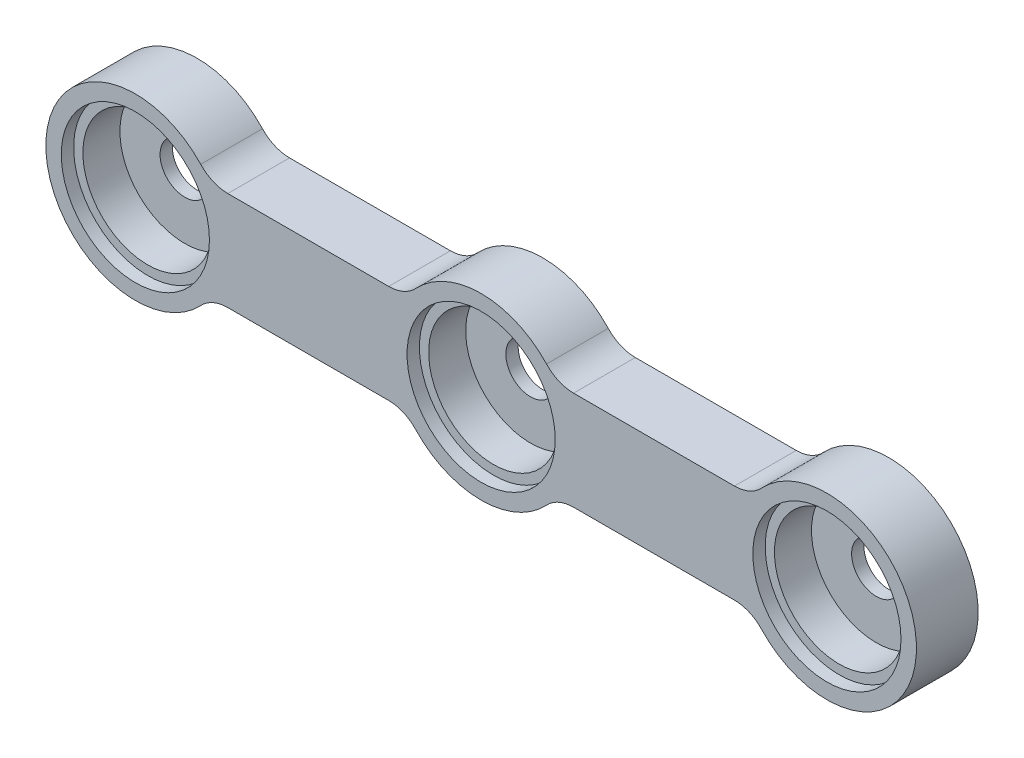
ISO-10303-21;
HEADER;
FILE_DESCRIPTION(('STEP AP214'),'2;1');
FILE_NAME('part.step','',(''),(''),'','','');
FILE_SCHEMA(('AUTOMOTIVE_DESIGN { 1 0 10303 214 1 1 1 1 }'));
ENDSEC;
DATA;
#1=APPLICATION_CONTEXT('core data for automotive mechanical design processes');
#2=APPLICATION_PROTOCOL_DEFINITION('international standard','automotive_design',2000,#1);
#3=PRODUCT_CONTEXT('',#1,'mechanical');
#4=PRODUCT('Part','Part','',(#3));
#5=PRODUCT_RELATED_PRODUCT_CATEGORY('part','',(#4));
#6=PRODUCT_DEFINITION_FORMATION('','',#4);
#7=PRODUCT_DEFINITION_CONTEXT('part definition',#1,'design');
#8=PRODUCT_DEFINITION('design','',#6,#7);
#9=PRODUCT_DEFINITION_SHAPE('','',#8);
#10=(LENGTH_UNIT() NAMED_UNIT(*) SI_UNIT(.MILLI.,.METRE.));
#11=(NAMED_UNIT(*) PLANE_ANGLE_UNIT() SI_UNIT($,.RADIAN.));
#12=(NAMED_UNIT(*) SI_UNIT($,.STERADIAN.) SOLID_ANGLE_UNIT());
#13=UNCERTAINTY_MEASURE_WITH_UNIT(LENGTH_MEASURE(1.E-05),#10,'distance_accuracy_value','');
#14=(GEOMETRIC_REPRESENTATION_CONTEXT(3) GLOBAL_UNCERTAINTY_ASSIGNED_CONTEXT((#13)) GLOBAL_UNIT_ASSIGNED_CONTEXT((#10,
#11,#12)) REPRESENTATION_CONTEXT('',''));
#15=CARTESIAN_POINT('',(0.,0.,0.));
#16=DIRECTION('',(0.,0.,1.));
#17=DIRECTION('',(1.,0.,0.));
#18=AXIS2_PLACEMENT_3D('',#15,#16,#17);
#19=CARTESIAN_POINT('',(-68.758315938752,0.,4.));
#20=DIRECTION('',(0.,0.,-1.));
#21=DIRECTION('',(-1.,0.,0.));
#22=AXIS2_PLACEMENT_3D('',#19,#20,#21);
#23=CYLINDRICAL_SURFACE('',#22,2.);
#24=CARTESIAN_POINT('',(-68.758315938752,0.,0.));
#25=DIRECTION('',(0.,0.,-1.));
#26=DIRECTION('',(1.,0.,0.));
#27=AXIS2_PLACEMENT_3D('',#24,#25,#26);
#28=CIRCLE('',#27,2.);
#29=CARTESIAN_POINT('',(-66.758315938752,0.,0.));
#30=VERTEX_POINT('',#29);
#31=EDGE_CURVE('E307',#30,#30,#28,.T.);
#32=ORIENTED_EDGE('',*,*,#31,.T.);
#33=EDGE_LOOP('',(#32));
#34=FACE_BOUND('',#33,.T.);
#35=CARTESIAN_POINT('',(-68.758315938752,0.,1.));
#36=DIRECTION('',(0.,0.,1.));
#37=DIRECTION('',(1.,0.,0.));
#38=AXIS2_PLACEMENT_3D('',#35,#36,#37);
#39=CIRCLE('',#38,2.);
#40=CARTESIAN_POINT('',(-66.758315938752,0.,1.));
#41=VERTEX_POINT('',#40);
#42=EDGE_CURVE('E48',#41,#41,#39,.F.);
#43=ORIENTED_EDGE('',*,*,#42,.F.);
#44=EDGE_LOOP('',(#43));
#45=FACE_BOUND('',#44,.T.);
#46=ADVANCED_FACE('F44',(#34,#45),#23,.F.);
#47=CARTESIAN_POINT('',(-40.7533159387521,0.,4.));
#48=DIRECTION('',(0.,0.,-1.));
#49=DIRECTION('',(-1.,0.,0.));
#50=AXIS2_PLACEMENT_3D('',#47,#48,#49);
#51=CYLINDRICAL_SURFACE('',#50,2.);
#52=CARTESIAN_POINT('',(-40.7533159387521,0.,0.));
#53=DIRECTION('',(0.,0.,-1.));
#54=DIRECTION('',(-1.,0.,0.));
#55=AXIS2_PLACEMENT_3D('',#52,#53,#54);
#56=CIRCLE('',#55,2.);
#57=CARTESIAN_POINT('',(-42.7533159387521,0.,0.));
#58=VERTEX_POINT('',#57);
#59=EDGE_CURVE('E312',#58,#58,#56,.T.);
#60=ORIENTED_EDGE('',*,*,#59,.T.);
#61=EDGE_LOOP('',(#60));
#62=FACE_BOUND('',#61,.T.);
#63=CARTESIAN_POINT('',(-40.7533159387521,0.,1.));
#64=DIRECTION('',(0.,0.,1.));
#65=DIRECTION('',(1.,0.,0.));
#66=AXIS2_PLACEMENT_3D('',#63,#64,#65);
#67=CIRCLE('',#66,2.);
#68=CARTESIAN_POINT('',(-38.7533159387521,0.,1.));
#69=VERTEX_POINT('',#68);
#70=EDGE_CURVE('E299',#69,#69,#67,.F.);
#71=ORIENTED_EDGE('',*,*,#70,.F.);
#72=EDGE_LOOP('',(#71));
#73=FACE_BOUND('',#72,.T.);
#74=ADVANCED_FACE('F428',(#62,#73),#51,.F.);
#75=CARTESIAN_POINT('',(-12.7483159387521,0.,4.));
#76=DIRECTION('',(0.,0.,-1.));
#77=DIRECTION('',(-1.,0.,0.));
#78=AXIS2_PLACEMENT_3D('',#75,#76,#77);
#79=CYLINDRICAL_SURFACE('',#78,2.);
#80=CARTESIAN_POINT('',(-12.7483159387521,0.,0.));
#81=DIRECTION('',(0.,0.,-1.));
#82=DIRECTION('',(-1.,0.,0.));
#83=AXIS2_PLACEMENT_3D('',#80,#81,#82);
#84=CIRCLE('',#83,2.);
#85=CARTESIAN_POINT('',(-14.7483159387521,0.,0.));
#86=VERTEX_POINT('',#85);
#87=EDGE_CURVE('E318',#86,#86,#84,.T.);
#88=ORIENTED_EDGE('',*,*,#87,.T.);
#89=EDGE_LOOP('',(#88));
#90=FACE_BOUND('',#89,.T.);
#91=CARTESIAN_POINT('',(-12.7483159387521,0.,1.));
#92=DIRECTION('',(0.,0.,1.));
#93=DIRECTION('',(1.,0.,0.));
#94=AXIS2_PLACEMENT_3D('',#91,#92,#93);
#95=CIRCLE('',#94,2.);
#96=CARTESIAN_POINT('',(-10.7483159387521,0.,1.));
#97=VERTEX_POINT('',#96);
#98=EDGE_CURVE('E296',#97,#97,#95,.F.);
#99=ORIENTED_EDGE('',*,*,#98,.F.);
#100=EDGE_LOOP('',(#99));
#101=FACE_BOUND('',#100,.T.);
#102=ADVANCED_FACE('F433',(#90,#101),#79,.F.);
#103=CARTESIAN_POINT('',(-68.758315938752,-4.,5.));
#104=DIRECTION('',(0.,1.,0.));
#105=DIRECTION('',(0.,0.,1.));
#106=AXIS2_PLACEMENT_3D('',#103,#104,#105);
#107=PLANE('',#106);
#108=DIRECTION('',(1.,0.,0.));
#109=VECTOR('',#108,1.);
#110=CARTESIAN_POINT('',(-68.758315938752,-4.,0.));
#111=LINE('',#110,#109);
#112=CARTESIAN_POINT('',(-33.2658263728161,-4.,0.));
#113=VERTEX_POINT('',#112);
#114=CARTESIAN_POINT('',(-20.235805504688,-4.,0.));
#115=VERTEX_POINT('',#114);
#116=EDGE_CURVE('E178',#113,#115,#111,.T.);
#117=ORIENTED_EDGE('',*,*,#116,.T.);
#118=DIRECTION('',(0.,0.,-1.));
#119=VECTOR('',#118,1.);
#120=CARTESIAN_POINT('',(-20.235805504688,-4.,5.));
#121=LINE('',#120,#119);
#122=CARTESIAN_POINT('',(-20.235805504688,-4.,5.));
#123=VERTEX_POINT('',#122);
#124=EDGE_CURVE('E183',#115,#123,#121,.F.);
#125=ORIENTED_EDGE('',*,*,#124,.T.);
#126=DIRECTION('',(1.,0.,0.));
#127=VECTOR('',#126,1.);
#128=CARTESIAN_POINT('',(-68.758315938752,-4.,5.));
#129=LINE('',#128,#127);
#130=CARTESIAN_POINT('',(-33.2658263728161,-4.,5.));
#131=VERTEX_POINT('',#130);
#132=EDGE_CURVE('E181',#131,#123,#129,.T.);
#133=ORIENTED_EDGE('',*,*,#132,.F.);
#134=DIRECTION('',(0.,0.,-1.));
#135=VECTOR('',#134,1.);
#136=CARTESIAN_POINT('',(-33.2658263728161,-4.,5.));
#137=LINE('',#136,#135);
#138=EDGE_CURVE('E163',#131,#113,#137,.T.);
#139=ORIENTED_EDGE('',*,*,#138,.T.);
#140=EDGE_LOOP('',(#117,#125,#133,#139));
#141=FACE_BOUND('',#140,.T.);
#142=ADVANCED_FACE('F176',(#141),#107,.F.);
#143=CARTESIAN_POINT('',(-68.758315938752,4.,5.));
#144=DIRECTION('',(0.,-1.,0.));
#145=DIRECTION('',(0.,0.,-1.));
#146=AXIS2_PLACEMENT_3D('',#143,#144,#145);
#147=PLANE('',#146);
#148=DIRECTION('',(-1.,0.,0.));
#149=VECTOR('',#148,1.);
#150=CARTESIAN_POINT('',(-68.758315938752,4.,5.));
#151=LINE('',#150,#149);
#152=CARTESIAN_POINT('',(-48.240805504688,4.,5.));
#153=VERTEX_POINT('',#152);
#154=CARTESIAN_POINT('',(-61.2708263728161,4.,5.));
#155=VERTEX_POINT('',#154);
#156=EDGE_CURVE('E204',#153,#155,#151,.T.);
#157=ORIENTED_EDGE('',*,*,#156,.F.);
#158=DIRECTION('',(0.,0.,-1.));
#159=VECTOR('',#158,1.);
#160=CARTESIAN_POINT('',(-48.240805504688,4.,5.));
#161=LINE('',#160,#159);
#162=CARTESIAN_POINT('',(-48.240805504688,4.,0.));
#163=VERTEX_POINT('',#162);
#164=EDGE_CURVE('E249',#153,#163,#161,.T.);
#165=ORIENTED_EDGE('',*,*,#164,.T.);
#166=DIRECTION('',(-1.,0.,0.));
#167=VECTOR('',#166,1.);
#168=CARTESIAN_POINT('',(-68.758315938752,4.,0.));
#169=LINE('',#168,#167);
#170=CARTESIAN_POINT('',(-61.2708263728161,4.,0.));
#171=VERTEX_POINT('',#170);
#172=EDGE_CURVE('E198',#163,#171,#169,.T.);
#173=ORIENTED_EDGE('',*,*,#172,.T.);
#174=DIRECTION('',(0.,0.,-1.));
#175=VECTOR('',#174,1.);
#176=CARTESIAN_POINT('',(-61.2708263728161,4.,5.));
#177=LINE('',#176,#175);
#178=EDGE_CURVE('E245',#171,#155,#177,.F.);
#179=ORIENTED_EDGE('',*,*,#178,.T.);
#180=EDGE_LOOP('',(#157,#165,#173,#179));
#181=FACE_BOUND('',#180,.T.);
#182=ADVANCED_FACE('F397',(#181),#147,.F.);
#183=CARTESIAN_POINT('',(-61.2708263728161,-4.,0.));
#184=VERTEX_POINT('',#183);
#185=CARTESIAN_POINT('',(-48.240805504688,-4.,0.));
#186=VERTEX_POINT('',#185);
#187=EDGE_CURVE('E192',#184,#186,#111,.T.);
#188=ORIENTED_EDGE('',*,*,#187,.T.);
#189=DIRECTION('',(0.,0.,-1.));
#190=VECTOR('',#189,1.);
#191=CARTESIAN_POINT('',(-48.240805504688,-4.,5.));
#192=LINE('',#191,#190);
#193=CARTESIAN_POINT('',(-48.240805504688,-4.,5.));
#194=VERTEX_POINT('',#193);
#195=EDGE_CURVE('E236',#186,#194,#192,.F.);
#196=ORIENTED_EDGE('',*,*,#195,.T.);
#197=CARTESIAN_POINT('',(-61.2708263728161,-4.,5.));
#198=VERTEX_POINT('',#197);
#199=EDGE_CURVE('E365',#198,#194,#129,.T.);
#200=ORIENTED_EDGE('',*,*,#199,.F.);
#201=DIRECTION('',(0.,0.,-1.));
#202=VECTOR('',#201,1.);
#203=CARTESIAN_POINT('',(-61.2708263728161,-4.,5.));
#204=LINE('',#203,#202);
#205=EDGE_CURVE('E232',#198,#184,#204,.T.);
#206=ORIENTED_EDGE('',*,*,#205,.T.);
#207=EDGE_LOOP('',(#188,#196,#200,#206));
#208=FACE_BOUND('',#207,.T.);
#209=ADVANCED_FACE('F410',(#208),#107,.F.);
#210=CARTESIAN_POINT('',(-20.235805504688,4.,5.));
#211=VERTEX_POINT('',#210);
#212=CARTESIAN_POINT('',(-33.2658263728161,4.,5.));
#213=VERTEX_POINT('',#212);
#214=EDGE_CURVE('E184',#211,#213,#151,.T.);
#215=ORIENTED_EDGE('',*,*,#214,.F.);
#216=DIRECTION('',(0.,0.,-1.));
#217=VECTOR('',#216,1.);
#218=CARTESIAN_POINT('',(-20.235805504688,4.,5.));
#219=LINE('',#218,#217);
#220=CARTESIAN_POINT('',(-20.235805504688,4.,0.));
#221=VERTEX_POINT('',#220);
#222=EDGE_CURVE('E222',#211,#221,#219,.T.);
#223=ORIENTED_EDGE('',*,*,#222,.T.);
#224=CARTESIAN_POINT('',(-33.2658263728161,4.,0.));
#225=VERTEX_POINT('',#224);
#226=EDGE_CURVE('E208',#221,#225,#169,.T.);
#227=ORIENTED_EDGE('',*,*,#226,.T.);
#228=DIRECTION('',(0.,0.,-1.));
#229=VECTOR('',#228,1.);
#230=CARTESIAN_POINT('',(-33.2658263728161,4.,5.));
#231=LINE('',#230,#229);
#232=EDGE_CURVE('E218',#225,#213,#231,.F.);
#233=ORIENTED_EDGE('',*,*,#232,.T.);
#234=EDGE_LOOP('',(#215,#223,#227,#233));
#235=FACE_BOUND('',#234,.T.);
#236=ADVANCED_FACE('F376',(#235),#147,.F.);
#237=CARTESIAN_POINT('',(-68.758315938752,0.,5.));
#238=DIRECTION('',(0.,0.,1.));
#239=DIRECTION('',(1.,0.,0.));
#240=AXIS2_PLACEMENT_3D('',#237,#238,#239);
#241=PLANE('',#240);
#242=CARTESIAN_POINT('',(-68.758315938752,0.,5.));
#243=DIRECTION('',(0.,0.,1.));
#244=DIRECTION('',(1.,0.,0.));
#245=AXIS2_PLACEMENT_3D('',#242,#243,#244);
#246=CIRCLE('',#245,6.);
#247=CARTESIAN_POINT('',(-62.758315938752,0.,5.));
#248=VERTEX_POINT('',#247);
#249=EDGE_CURVE('E327',#248,#248,#246,.T.);
#250=ORIENTED_EDGE('',*,*,#249,.F.);
#251=EDGE_LOOP('',(#250));
#252=FACE_BOUND('',#251,.T.);
#253=CARTESIAN_POINT('',(-40.7533159387521,0.,5.));
#254=DIRECTION('',(0.,0.,1.));
#255=DIRECTION('',(1.,0.,0.));
#256=AXIS2_PLACEMENT_3D('',#253,#254,#255);
#257=CIRCLE('',#256,6.);
#258=CARTESIAN_POINT('',(-34.7533159387521,0.,5.));
#259=VERTEX_POINT('',#258);
#260=EDGE_CURVE('E331',#259,#259,#257,.T.);
#261=ORIENTED_EDGE('',*,*,#260,.F.);
#262=EDGE_LOOP('',(#261));
#263=FACE_BOUND('',#262,.T.);
#264=CARTESIAN_POINT('',(-12.7483159387521,0.,5.));
#265=DIRECTION('',(0.,0.,1.));
#266=DIRECTION('',(1.,0.,0.));
#267=AXIS2_PLACEMENT_3D('',#264,#265,#266);
#268=CIRCLE('',#267,6.);
#269=CARTESIAN_POINT('',(-6.74831593875206,0.,5.));
#270=VERTEX_POINT('',#269);
#271=EDGE_CURVE('E339',#270,#270,#268,.T.);
#272=ORIENTED_EDGE('',*,*,#271,.F.);
#273=EDGE_LOOP('',(#272));
#274=FACE_BOUND('',#273,.T.);
#275=CARTESIAN_POINT('',(-40.7533159387521,0.,5.));
#276=DIRECTION('',(0.,0.,-1.));
#277=DIRECTION('',(-1.,0.,0.));
#278=AXIS2_PLACEMENT_3D('',#275,#276,#277);
#279=CIRCLE('',#278,7.25);
#280=CARTESIAN_POINT('',(-35.4572867335778,-4.95121951219512,5.));
#281=VERTEX_POINT('',#280);
#282=CARTESIAN_POINT('',(-46.0493451439263,-4.95121951219512,5.));
#283=VERTEX_POINT('',#282);
#284=EDGE_CURVE('E200',#281,#283,#279,.T.);
#285=ORIENTED_EDGE('',*,*,#284,.F.);
#286=CARTESIAN_POINT('',(-33.2658263728161,-7.,5.));
#287=DIRECTION('',(0.,0.,1.));
#288=DIRECTION('',(1.,0.,0.));
#289=AXIS2_PLACEMENT_3D('',#286,#287,#288);
#290=CIRCLE('',#289,3.);
#291=EDGE_CURVE('E170',#281,#131,#290,.F.);
#292=ORIENTED_EDGE('',*,*,#291,.T.);
#293=ORIENTED_EDGE('',*,*,#132,.T.);
#294=CARTESIAN_POINT('',(-20.235805504688,-7.,5.));
#295=DIRECTION('',(0.,0.,1.));
#296=DIRECTION('',(1.,0.,0.));
#297=AXIS2_PLACEMENT_3D('',#294,#295,#296);
#298=CIRCLE('',#297,3.);
#299=CARTESIAN_POINT('',(-18.0443451439263,-4.95121951219512,5.));
#300=VERTEX_POINT('',#299);
#301=EDGE_CURVE('E258',#123,#300,#298,.F.);
#302=ORIENTED_EDGE('',*,*,#301,.T.);
#303=CARTESIAN_POINT('',(-12.7483159387521,0.,5.));
#304=DIRECTION('',(0.,0.,-1.));
#305=DIRECTION('',(1.,0.,0.));
#306=AXIS2_PLACEMENT_3D('',#303,#304,#305);
#307=CIRCLE('',#306,7.25);
#308=CARTESIAN_POINT('',(-18.0443451439263,4.95121951219512,5.));
#309=VERTEX_POINT('',#308);
#310=EDGE_CURVE('E326',#309,#300,#307,.T.);
#311=ORIENTED_EDGE('',*,*,#310,.F.);
#312=CARTESIAN_POINT('',(-20.235805504688,7.,5.));
#313=DIRECTION('',(0.,0.,1.));
#314=DIRECTION('',(1.,0.,0.));
#315=AXIS2_PLACEMENT_3D('',#312,#313,#314);
#316=CIRCLE('',#315,3.);
#317=EDGE_CURVE('E266',#309,#211,#316,.F.);
#318=ORIENTED_EDGE('',*,*,#317,.T.);
#319=ORIENTED_EDGE('',*,*,#214,.T.);
#320=CARTESIAN_POINT('',(-33.2658263728161,7.,5.));
#321=DIRECTION('',(0.,0.,1.));
#322=DIRECTION('',(1.,0.,0.));
#323=AXIS2_PLACEMENT_3D('',#320,#321,#322);
#324=CIRCLE('',#323,3.);
#325=CARTESIAN_POINT('',(-35.4572867335778,4.95121951219512,5.));
#326=VERTEX_POINT('',#325);
#327=EDGE_CURVE('E269',#213,#326,#324,.F.);
#328=ORIENTED_EDGE('',*,*,#327,.T.);
#329=CARTESIAN_POINT('',(-46.0493451439263,4.95121951219512,5.));
#330=VERTEX_POINT('',#329);
#331=EDGE_CURVE('E193',#330,#326,#279,.T.);
#332=ORIENTED_EDGE('',*,*,#331,.F.);
#333=CARTESIAN_POINT('',(-48.240805504688,7.,5.));
#334=DIRECTION('',(0.,0.,1.));
#335=DIRECTION('',(1.,0.,0.));
#336=AXIS2_PLACEMENT_3D('',#333,#334,#335);
#337=CIRCLE('',#336,3.);
#338=EDGE_CURVE('E284',#330,#153,#337,.F.);
#339=ORIENTED_EDGE('',*,*,#338,.T.);
#340=ORIENTED_EDGE('',*,*,#156,.T.);
#341=CARTESIAN_POINT('',(-61.2708263728161,7.,5.));
#342=DIRECTION('',(0.,0.,1.));
#343=DIRECTION('',(1.,0.,0.));
#344=AXIS2_PLACEMENT_3D('',#341,#342,#343);
#345=CIRCLE('',#344,3.);
#346=CARTESIAN_POINT('',(-63.4622867335778,4.95121951219513,5.));
#347=VERTEX_POINT('',#346);
#348=EDGE_CURVE('E54',#155,#347,#345,.F.);
#349=ORIENTED_EDGE('',*,*,#348,.T.);
#350=CARTESIAN_POINT('',(-68.758315938752,0.,5.));
#351=DIRECTION('',(0.,0.,-1.));
#352=DIRECTION('',(-1.,0.,0.));
#353=AXIS2_PLACEMENT_3D('',#350,#351,#352);
#354=CIRCLE('',#353,7.25000000000001);
#355=CARTESIAN_POINT('',(-63.4622867335778,-4.95121951219513,5.));
#356=VERTEX_POINT('',#355);
#357=EDGE_CURVE('E350',#356,#347,#354,.T.);
#358=ORIENTED_EDGE('',*,*,#357,.F.);
#359=CARTESIAN_POINT('',(-61.2708263728161,-7.,5.));
#360=DIRECTION('',(0.,0.,1.));
#361=DIRECTION('',(1.,0.,0.));
#362=AXIS2_PLACEMENT_3D('',#359,#360,#361);
#363=CIRCLE('',#362,3.);
#364=EDGE_CURVE('E171',#356,#198,#363,.F.);
#365=ORIENTED_EDGE('',*,*,#364,.T.);
#366=ORIENTED_EDGE('',*,*,#199,.T.);
#367=CARTESIAN_POINT('',(-48.240805504688,-7.,5.));
#368=DIRECTION('',(0.,0.,1.));
#369=DIRECTION('',(1.,0.,0.));
#370=AXIS2_PLACEMENT_3D('',#367,#368,#369);
#371=CIRCLE('',#370,3.);
#372=EDGE_CURVE('E275',#194,#283,#371,.F.);
#373=ORIENTED_EDGE('',*,*,#372,.T.);
#374=EDGE_LOOP('',(#285,#292,#293,#302,#311,#318,#319,#328,#332,#339,#340,#349,#358,#365,#366,#373));
#375=FACE_BOUND('',#374,.T.);
#376=ADVANCED_FACE('F385',(#252,#263,#274,#375),#241,.T.);
#377=CARTESIAN_POINT('',(-68.758315938752,0.,0.));
#378=DIRECTION('',(0.,0.,1.));
#379=DIRECTION('',(1.,0.,0.));
#380=AXIS2_PLACEMENT_3D('',#377,#378,#379);
#381=PLANE('',#380);
#382=ORIENTED_EDGE('',*,*,#87,.F.);
#383=EDGE_LOOP('',(#382));
#384=FACE_BOUND('',#383,.T.);
#385=ORIENTED_EDGE('',*,*,#59,.F.);
#386=EDGE_LOOP('',(#385));
#387=FACE_BOUND('',#386,.T.);
#388=ORIENTED_EDGE('',*,*,#31,.F.);
#389=EDGE_LOOP('',(#388));
#390=FACE_BOUND('',#389,.T.);
#391=ORIENTED_EDGE('',*,*,#226,.F.);
#392=CARTESIAN_POINT('',(-20.235805504688,7.,0.));
#393=DIRECTION('',(0.,0.,1.));
#394=DIRECTION('',(1.,0.,0.));
#395=AXIS2_PLACEMENT_3D('',#392,#393,#394);
#396=CIRCLE('',#395,3.);
#397=CARTESIAN_POINT('',(-18.0443451439263,4.95121951219512,0.));
#398=VERTEX_POINT('',#397);
#399=EDGE_CURVE('E263',#221,#398,#396,.T.);
#400=ORIENTED_EDGE('',*,*,#399,.T.);
#401=CARTESIAN_POINT('',(-12.7483159387521,0.,0.));
#402=DIRECTION('',(0.,0.,-1.));
#403=DIRECTION('',(1.,0.,0.));
#404=AXIS2_PLACEMENT_3D('',#401,#402,#403);
#405=CIRCLE('',#404,7.25);
#406=CARTESIAN_POINT('',(-18.0443451439263,-4.95121951219512,0.));
#407=VERTEX_POINT('',#406);
#408=EDGE_CURVE('E347',#398,#407,#405,.T.);
#409=ORIENTED_EDGE('',*,*,#408,.T.);
#410=CARTESIAN_POINT('',(-20.235805504688,-7.,0.));
#411=DIRECTION('',(0.,0.,1.));
#412=DIRECTION('',(1.,0.,0.));
#413=AXIS2_PLACEMENT_3D('',#410,#411,#412);
#414=CIRCLE('',#413,3.);
#415=EDGE_CURVE('E190',#407,#115,#414,.T.);
#416=ORIENTED_EDGE('',*,*,#415,.T.);
#417=ORIENTED_EDGE('',*,*,#116,.F.);
#418=CARTESIAN_POINT('',(-33.2658263728161,-7.,0.));
#419=DIRECTION('',(0.,0.,1.));
#420=DIRECTION('',(1.,0.,0.));
#421=AXIS2_PLACEMENT_3D('',#418,#419,#420);
#422=CIRCLE('',#421,3.);
#423=CARTESIAN_POINT('',(-35.4572867335778,-4.95121951219512,0.));
#424=VERTEX_POINT('',#423);
#425=EDGE_CURVE('E159',#113,#424,#422,.T.);
#426=ORIENTED_EDGE('',*,*,#425,.T.);
#427=CARTESIAN_POINT('',(-40.7533159387521,0.,0.));
#428=DIRECTION('',(0.,0.,-1.));
#429=DIRECTION('',(-1.,0.,0.));
#430=AXIS2_PLACEMENT_3D('',#427,#428,#429);
#431=CIRCLE('',#430,7.25);
#432=CARTESIAN_POINT('',(-46.0493451439263,-4.95121951219512,0.));
#433=VERTEX_POINT('',#432);
#434=EDGE_CURVE('E358',#424,#433,#431,.T.);
#435=ORIENTED_EDGE('',*,*,#434,.T.);
#436=CARTESIAN_POINT('',(-48.240805504688,-7.,0.));
#437=DIRECTION('',(0.,0.,1.));
#438=DIRECTION('',(1.,0.,0.));
#439=AXIS2_PLACEMENT_3D('',#436,#437,#438);
#440=CIRCLE('',#439,3.);
#441=EDGE_CURVE('E278',#433,#186,#440,.T.);
#442=ORIENTED_EDGE('',*,*,#441,.T.);
#443=ORIENTED_EDGE('',*,*,#187,.F.);
#444=CARTESIAN_POINT('',(-61.2708263728161,-7.,0.));
#445=DIRECTION('',(0.,0.,1.));
#446=DIRECTION('',(1.,0.,0.));
#447=AXIS2_PLACEMENT_3D('',#444,#445,#446);
#448=CIRCLE('',#447,3.);
#449=CARTESIAN_POINT('',(-63.4622867335778,-4.95121951219513,0.));
#450=VERTEX_POINT('',#449);
#451=EDGE_CURVE('E287',#184,#450,#448,.T.);
#452=ORIENTED_EDGE('',*,*,#451,.T.);
#453=CARTESIAN_POINT('',(-68.758315938752,0.,0.));
#454=DIRECTION('',(0.,0.,-1.));
#455=DIRECTION('',(-1.,0.,0.));
#456=AXIS2_PLACEMENT_3D('',#453,#454,#455);
#457=CIRCLE('',#456,7.25000000000001);
#458=CARTESIAN_POINT('',(-63.4622867335778,4.95121951219513,0.));
#459=VERTEX_POINT('',#458);
#460=EDGE_CURVE('E354',#450,#459,#457,.T.);
#461=ORIENTED_EDGE('',*,*,#460,.T.);
#462=CARTESIAN_POINT('',(-61.2708263728161,7.,0.));
#463=DIRECTION('',(0.,0.,1.));
#464=DIRECTION('',(1.,0.,0.));
#465=AXIS2_PLACEMENT_3D('',#462,#463,#464);
#466=CIRCLE('',#465,3.);
#467=EDGE_CURVE('E11',#459,#171,#466,.T.);
#468=ORIENTED_EDGE('',*,*,#467,.T.);
#469=ORIENTED_EDGE('',*,*,#172,.F.);
#470=CARTESIAN_POINT('',(-48.240805504688,7.,0.));
#471=DIRECTION('',(0.,0.,1.));
#472=DIRECTION('',(1.,0.,0.));
#473=AXIS2_PLACEMENT_3D('',#470,#471,#472);
#474=CIRCLE('',#473,3.);
#475=CARTESIAN_POINT('',(-46.0493451439263,4.95121951219512,0.));
#476=VERTEX_POINT('',#475);
#477=EDGE_CURVE('E281',#163,#476,#474,.T.);
#478=ORIENTED_EDGE('',*,*,#477,.T.);
#479=CARTESIAN_POINT('',(-35.4572867335778,4.95121951219512,0.));
#480=VERTEX_POINT('',#479);
#481=EDGE_CURVE('E363',#476,#480,#431,.T.);
#482=ORIENTED_EDGE('',*,*,#481,.T.);
#483=CARTESIAN_POINT('',(-33.2658263728161,7.,0.));
#484=DIRECTION('',(0.,0.,1.));
#485=DIRECTION('',(1.,0.,0.));
#486=AXIS2_PLACEMENT_3D('',#483,#484,#485);
#487=CIRCLE('',#486,3.);
#488=EDGE_CURVE('E272',#480,#225,#487,.T.);
#489=ORIENTED_EDGE('',*,*,#488,.T.);
#490=EDGE_LOOP('',(#391,#400,#409,#416,#417,#426,#435,#442,#443,#452,#461,#468,#469,#478,#482,#489));
#491=FACE_BOUND('',#490,.T.);
#492=ADVANCED_FACE('F187',(#384,#387,#390,#491),#381,.F.);
#493=CARTESIAN_POINT('',(-40.7533159387521,0.,5.));
#494=DIRECTION('',(0.,0.,-1.));
#495=DIRECTION('',(-1.,0.,0.));
#496=AXIS2_PLACEMENT_3D('',#493,#494,#495);
#497=CYLINDRICAL_SURFACE('',#496,7.25);
#498=ORIENTED_EDGE('',*,*,#331,.T.);
#499=DIRECTION('',(0.,0.,-1.));
#500=VECTOR('',#499,1.);
#501=CARTESIAN_POINT('',(-35.4572867335778,4.95121951219512,5.));
#502=LINE('',#501,#500);
#503=EDGE_CURVE('E229',#326,#480,#502,.T.);
#504=ORIENTED_EDGE('',*,*,#503,.T.);
#505=ORIENTED_EDGE('',*,*,#481,.F.);
#506=DIRECTION('',(0.,0.,-1.));
#507=VECTOR('',#506,1.);
#508=CARTESIAN_POINT('',(-46.0493451439263,4.95121951219512,5.));
#509=LINE('',#508,#507);
#510=EDGE_CURVE('E226',#476,#330,#509,.F.);
#511=ORIENTED_EDGE('',*,*,#510,.T.);
#512=EDGE_LOOP('',(#498,#504,#505,#511));
#513=FACE_BOUND('',#512,.T.);
#514=ADVANCED_FACE('F388',(#513),#497,.T.);
#515=ORIENTED_EDGE('',*,*,#284,.T.);
#516=DIRECTION('',(0.,0.,-1.));
#517=VECTOR('',#516,1.);
#518=CARTESIAN_POINT('',(-46.0493451439263,-4.95121951219512,5.));
#519=LINE('',#518,#517);
#520=EDGE_CURVE('E242',#283,#433,#519,.T.);
#521=ORIENTED_EDGE('',*,*,#520,.T.);
#522=ORIENTED_EDGE('',*,*,#434,.F.);
#523=DIRECTION('',(0.,0.,-1.));
#524=VECTOR('',#523,1.);
#525=CARTESIAN_POINT('',(-35.4572867335778,-4.95121951219512,5.));
#526=LINE('',#525,#524);
#527=EDGE_CURVE('E164',#424,#281,#526,.F.);
#528=ORIENTED_EDGE('',*,*,#527,.T.);
#529=EDGE_LOOP('',(#515,#521,#522,#528));
#530=FACE_BOUND('',#529,.T.);
#531=ADVANCED_FACE('F417',(#530),#497,.T.);
#532=CARTESIAN_POINT('',(-68.758315938752,0.,5.));
#533=DIRECTION('',(0.,0.,-1.));
#534=DIRECTION('',(-1.,0.,0.));
#535=AXIS2_PLACEMENT_3D('',#532,#533,#534);
#536=CYLINDRICAL_SURFACE('',#535,7.25000000000001);
#537=ORIENTED_EDGE('',*,*,#460,.F.);
#538=DIRECTION('',(0.,0.,-1.));
#539=VECTOR('',#538,1.);
#540=CARTESIAN_POINT('',(-63.4622867335778,-4.95121951219513,5.));
#541=LINE('',#540,#539);
#542=EDGE_CURVE('E68',#450,#356,#541,.F.);
#543=ORIENTED_EDGE('',*,*,#542,.T.);
#544=ORIENTED_EDGE('',*,*,#357,.T.);
#545=DIRECTION('',(0.,0.,-1.));
#546=VECTOR('',#545,1.);
#547=CARTESIAN_POINT('',(-63.4622867335778,4.95121951219513,5.));
#548=LINE('',#547,#546);
#549=EDGE_CURVE('E253',#347,#459,#548,.T.);
#550=ORIENTED_EDGE('',*,*,#549,.T.);
#551=EDGE_LOOP('',(#537,#543,#544,#550));
#552=FACE_BOUND('',#551,.T.);
#553=ADVANCED_FACE('F403',(#552),#536,.T.);
#554=CARTESIAN_POINT('',(-12.7483159387521,0.,5.));
#555=DIRECTION('',(0.,0.,-1.));
#556=DIRECTION('',(-1.,0.,0.));
#557=AXIS2_PLACEMENT_3D('',#554,#555,#556);
#558=CYLINDRICAL_SURFACE('',#557,7.25);
#559=ORIENTED_EDGE('',*,*,#310,.T.);
#560=DIRECTION('',(0.,0.,-1.));
#561=VECTOR('',#560,1.);
#562=CARTESIAN_POINT('',(-18.0443451439263,-4.95121951219512,5.));
#563=LINE('',#562,#561);
#564=EDGE_CURVE('E215',#300,#407,#563,.T.);
#565=ORIENTED_EDGE('',*,*,#564,.T.);
#566=ORIENTED_EDGE('',*,*,#408,.F.);
#567=DIRECTION('',(0.,0.,-1.));
#568=VECTOR('',#567,1.);
#569=CARTESIAN_POINT('',(-18.0443451439263,4.95121951219512,5.));
#570=LINE('',#569,#568);
#571=EDGE_CURVE('E212',#398,#309,#570,.F.);
#572=ORIENTED_EDGE('',*,*,#571,.T.);
#573=EDGE_LOOP('',(#559,#565,#566,#572));
#574=FACE_BOUND('',#573,.T.);
#575=ADVANCED_FACE('F424',(#574),#558,.T.);
#576=CARTESIAN_POINT('',(-12.7483159387521,0.,4.));
#577=DIRECTION('',(0.,0.,1.));
#578=DIRECTION('',(1.,0.,0.));
#579=AXIS2_PLACEMENT_3D('',#576,#577,#578);
#580=CYLINDRICAL_SURFACE('',#579,6.);
#581=CARTESIAN_POINT('',(-12.7483159387521,0.,4.));
#582=DIRECTION('',(0.,0.,1.));
#583=DIRECTION('',(1.,0.,0.));
#584=AXIS2_PLACEMENT_3D('',#581,#582,#583);
#585=CIRCLE('',#584,6.);
#586=CARTESIAN_POINT('',(-6.74831593875206,0.,4.));
#587=VERTEX_POINT('',#586);
#588=EDGE_CURVE('E343',#587,#587,#585,.T.);
#589=ORIENTED_EDGE('',*,*,#588,.F.);
#590=EDGE_LOOP('',(#589));
#591=FACE_BOUND('',#590,.T.);
#592=ORIENTED_EDGE('',*,*,#271,.T.);
#593=EDGE_LOOP('',(#592));
#594=FACE_BOUND('',#593,.T.);
#595=ADVANCED_FACE('F457',(#591,#594),#580,.F.);
#596=CARTESIAN_POINT('',(-12.7483159387521,0.,4.));
#597=DIRECTION('',(0.,0.,1.));
#598=DIRECTION('',(1.,0.,0.));
#599=AXIS2_PLACEMENT_3D('',#596,#597,#598);
#600=PLANE('',#599);
#601=CARTESIAN_POINT('',(-12.7483159387521,0.,4.));
#602=DIRECTION('',(0.,0.,1.));
#603=DIRECTION('',(1.,0.,0.));
#604=AXIS2_PLACEMENT_3D('',#601,#602,#603);
#605=CIRCLE('',#604,5.25);
#606=CARTESIAN_POINT('',(-7.49831593875207,0.,4.));
#607=VERTEX_POINT('',#606);
#608=EDGE_CURVE('E527',#607,#607,#605,.T.);
#609=ORIENTED_EDGE('',*,*,#608,.F.);
#610=EDGE_LOOP('',(#609));
#611=FACE_BOUND('',#610,.T.);
#612=ORIENTED_EDGE('',*,*,#588,.T.);
#613=EDGE_LOOP('',(#612));
#614=FACE_BOUND('',#613,.T.);
#615=ADVANCED_FACE('F452',(#611,#614),#600,.T.);
#616=CARTESIAN_POINT('',(-40.7533159387521,0.,4.));
#617=DIRECTION('',(0.,0.,1.));
#618=DIRECTION('',(1.,0.,0.));
#619=AXIS2_PLACEMENT_3D('',#616,#617,#618);
#620=CYLINDRICAL_SURFACE('',#619,6.);
#621=CARTESIAN_POINT('',(-40.7533159387521,0.,4.));
#622=DIRECTION('',(0.,0.,1.));
#623=DIRECTION('',(1.,0.,0.));
#624=AXIS2_PLACEMENT_3D('',#621,#622,#623);
#625=CIRCLE('',#624,6.);
#626=CARTESIAN_POINT('',(-34.7533159387521,0.,4.));
#627=VERTEX_POINT('',#626);
#628=EDGE_CURVE('E335',#627,#627,#625,.T.);
#629=ORIENTED_EDGE('',*,*,#628,.F.);
#630=EDGE_LOOP('',(#629));
#631=FACE_BOUND('',#630,.T.);
#632=ORIENTED_EDGE('',*,*,#260,.T.);
#633=EDGE_LOOP('',(#632));
#634=FACE_BOUND('',#633,.T.);
#635=ADVANCED_FACE('F449',(#631,#634),#620,.F.);
#636=CARTESIAN_POINT('',(-40.7533159387521,0.,4.));
#637=DIRECTION('',(0.,0.,1.));
#638=DIRECTION('',(1.,0.,0.));
#639=AXIS2_PLACEMENT_3D('',#636,#637,#638);
#640=PLANE('',#639);
#641=CARTESIAN_POINT('',(-40.7533159387521,0.,4.));
#642=DIRECTION('',(0.,0.,1.));
#643=DIRECTION('',(1.,0.,0.));
#644=AXIS2_PLACEMENT_3D('',#641,#642,#643);
#645=CIRCLE('',#644,5.25);
#646=CARTESIAN_POINT('',(-35.5033159387521,0.,4.));
#647=VERTEX_POINT('',#646);
#648=EDGE_CURVE('E535',#647,#647,#645,.T.);
#649=ORIENTED_EDGE('',*,*,#648,.F.);
#650=EDGE_LOOP('',(#649));
#651=FACE_BOUND('',#650,.T.);
#652=ORIENTED_EDGE('',*,*,#628,.T.);
#653=EDGE_LOOP('',(#652));
#654=FACE_BOUND('',#653,.T.);
#655=ADVANCED_FACE('F447',(#651,#654),#640,.T.);
#656=CARTESIAN_POINT('',(-68.758315938752,0.,4.));
#657=DIRECTION('',(0.,0.,1.));
#658=DIRECTION('',(1.,0.,0.));
#659=AXIS2_PLACEMENT_3D('',#656,#657,#658);
#660=CYLINDRICAL_SURFACE('',#659,6.);
#661=CARTESIAN_POINT('',(-68.758315938752,0.,4.));
#662=DIRECTION('',(0.,0.,1.));
#663=DIRECTION('',(1.,0.,0.));
#664=AXIS2_PLACEMENT_3D('',#661,#662,#663);
#665=CIRCLE('',#664,6.);
#666=CARTESIAN_POINT('',(-62.758315938752,0.,4.));
#667=VERTEX_POINT('',#666);
#668=EDGE_CURVE('E322',#667,#667,#665,.T.);
#669=ORIENTED_EDGE('',*,*,#668,.F.);
#670=EDGE_LOOP('',(#669));
#671=FACE_BOUND('',#670,.T.);
#672=ORIENTED_EDGE('',*,*,#249,.T.);
#673=EDGE_LOOP('',(#672));
#674=FACE_BOUND('',#673,.T.);
#675=ADVANCED_FACE('F443',(#671,#674),#660,.F.);
#676=CARTESIAN_POINT('',(-68.758315938752,0.,4.));
#677=DIRECTION('',(0.,0.,1.));
#678=DIRECTION('',(1.,0.,0.));
#679=AXIS2_PLACEMENT_3D('',#676,#677,#678);
#680=PLANE('',#679);
#681=CARTESIAN_POINT('',(-68.758315938752,0.,4.));
#682=DIRECTION('',(0.,0.,1.));
#683=DIRECTION('',(1.,0.,0.));
#684=AXIS2_PLACEMENT_3D('',#681,#682,#683);
#685=CIRCLE('',#684,5.25);
#686=CARTESIAN_POINT('',(-63.508315938752,0.,4.));
#687=VERTEX_POINT('',#686);
#688=EDGE_CURVE('E539',#687,#687,#685,.T.);
#689=ORIENTED_EDGE('',*,*,#688,.F.);
#690=EDGE_LOOP('',(#689));
#691=FACE_BOUND('',#690,.T.);
#692=ORIENTED_EDGE('',*,*,#668,.T.);
#693=EDGE_LOOP('',(#692));
#694=FACE_BOUND('',#693,.T.);
#695=ADVANCED_FACE('F439',(#691,#694),#680,.T.);
#696=CARTESIAN_POINT('',(-20.235805504688,-7.,5.));
#697=DIRECTION('',(0.,0.,-1.));
#698=DIRECTION('',(-1.,0.,0.));
#699=AXIS2_PLACEMENT_3D('',#696,#697,#698);
#700=CYLINDRICAL_SURFACE('',#699,3.);
#701=ORIENTED_EDGE('',*,*,#415,.F.);
#702=ORIENTED_EDGE('',*,*,#564,.F.);
#703=ORIENTED_EDGE('',*,*,#301,.F.);
#704=ORIENTED_EDGE('',*,*,#124,.F.);
#705=EDGE_LOOP('',(#701,#702,#703,#704));
#706=FACE_BOUND('',#705,.T.);
#707=ADVANCED_FACE('F442',(#706),#700,.F.);
#708=CARTESIAN_POINT('',(-20.235805504688,7.,5.));
#709=DIRECTION('',(0.,0.,-1.));
#710=DIRECTION('',(-1.,0.,0.));
#711=AXIS2_PLACEMENT_3D('',#708,#709,#710);
#712=CYLINDRICAL_SURFACE('',#711,3.);
#713=ORIENTED_EDGE('',*,*,#317,.F.);
#714=ORIENTED_EDGE('',*,*,#571,.F.);
#715=ORIENTED_EDGE('',*,*,#399,.F.);
#716=ORIENTED_EDGE('',*,*,#222,.F.);
#717=EDGE_LOOP('',(#713,#714,#715,#716));
#718=FACE_BOUND('',#717,.T.);
#719=ADVANCED_FACE('F475',(#718),#712,.F.);
#720=CARTESIAN_POINT('',(-33.2658263728161,7.,5.));
#721=DIRECTION('',(0.,0.,-1.));
#722=DIRECTION('',(-1.,0.,0.));
#723=AXIS2_PLACEMENT_3D('',#720,#721,#722);
#724=CYLINDRICAL_SURFACE('',#723,3.);
#725=ORIENTED_EDGE('',*,*,#488,.F.);
#726=ORIENTED_EDGE('',*,*,#503,.F.);
#727=ORIENTED_EDGE('',*,*,#327,.F.);
#728=ORIENTED_EDGE('',*,*,#232,.F.);
#729=EDGE_LOOP('',(#725,#726,#727,#728));
#730=FACE_BOUND('',#729,.T.);
#731=ADVANCED_FACE('F381',(#730),#724,.F.);
#732=CARTESIAN_POINT('',(-48.240805504688,-7.,5.));
#733=DIRECTION('',(0.,0.,-1.));
#734=DIRECTION('',(-1.,0.,0.));
#735=AXIS2_PLACEMENT_3D('',#732,#733,#734);
#736=CYLINDRICAL_SURFACE('',#735,3.);
#737=ORIENTED_EDGE('',*,*,#441,.F.);
#738=ORIENTED_EDGE('',*,*,#520,.F.);
#739=ORIENTED_EDGE('',*,*,#372,.F.);
#740=ORIENTED_EDGE('',*,*,#195,.F.);
#741=EDGE_LOOP('',(#737,#738,#739,#740));
#742=FACE_BOUND('',#741,.T.);
#743=ADVANCED_FACE('F414',(#742),#736,.F.);
#744=CARTESIAN_POINT('',(-48.240805504688,7.,5.));
#745=DIRECTION('',(0.,0.,-1.));
#746=DIRECTION('',(-1.,0.,0.));
#747=AXIS2_PLACEMENT_3D('',#744,#745,#746);
#748=CYLINDRICAL_SURFACE('',#747,3.);
#749=ORIENTED_EDGE('',*,*,#338,.F.);
#750=ORIENTED_EDGE('',*,*,#510,.F.);
#751=ORIENTED_EDGE('',*,*,#477,.F.);
#752=ORIENTED_EDGE('',*,*,#164,.F.);
#753=EDGE_LOOP('',(#749,#750,#751,#752));
#754=FACE_BOUND('',#753,.T.);
#755=ADVANCED_FACE('F393',(#754),#748,.F.);
#756=CARTESIAN_POINT('',(-61.2708263728161,-7.,5.));
#757=DIRECTION('',(0.,0.,-1.));
#758=DIRECTION('',(-1.,0.,0.));
#759=AXIS2_PLACEMENT_3D('',#756,#757,#758);
#760=CYLINDRICAL_SURFACE('',#759,3.);
#761=ORIENTED_EDGE('',*,*,#364,.F.);
#762=ORIENTED_EDGE('',*,*,#542,.F.);
#763=ORIENTED_EDGE('',*,*,#451,.F.);
#764=ORIENTED_EDGE('',*,*,#205,.F.);
#765=EDGE_LOOP('',(#761,#762,#763,#764));
#766=FACE_BOUND('',#765,.T.);
#767=ADVANCED_FACE('F408',(#766),#760,.F.);
#768=CARTESIAN_POINT('',(-33.2658263728161,-7.,5.));
#769=DIRECTION('',(0.,0.,-1.));
#770=DIRECTION('',(-1.,0.,0.));
#771=AXIS2_PLACEMENT_3D('',#768,#769,#770);
#772=CYLINDRICAL_SURFACE('',#771,3.);
#773=ORIENTED_EDGE('',*,*,#291,.F.);
#774=ORIENTED_EDGE('',*,*,#527,.F.);
#775=ORIENTED_EDGE('',*,*,#425,.F.);
#776=ORIENTED_EDGE('',*,*,#138,.F.);
#777=EDGE_LOOP('',(#773,#774,#775,#776));
#778=FACE_BOUND('',#777,.T.);
#779=ADVANCED_FACE('F162',(#778),#772,.F.);
#780=CARTESIAN_POINT('',(-61.2708263728161,7.,5.));
#781=DIRECTION('',(0.,0.,-1.));
#782=DIRECTION('',(-1.,0.,0.));
#783=AXIS2_PLACEMENT_3D('',#780,#781,#782);
#784=CYLINDRICAL_SURFACE('',#783,3.);
#785=ORIENTED_EDGE('',*,*,#467,.F.);
#786=ORIENTED_EDGE('',*,*,#549,.F.);
#787=ORIENTED_EDGE('',*,*,#348,.F.);
#788=ORIENTED_EDGE('',*,*,#178,.F.);
#789=EDGE_LOOP('',(#785,#786,#787,#788));
#790=FACE_BOUND('',#789,.T.);
#791=ADVANCED_FACE('F46',(#790),#784,.F.);
#792=CARTESIAN_POINT('',(-12.7483159387521,0.,1.));
#793=DIRECTION('',(0.,0.,1.));
#794=DIRECTION('',(1.,0.,0.));
#795=AXIS2_PLACEMENT_3D('',#792,#793,#794);
#796=PLANE('',#795);
#797=CARTESIAN_POINT('',(-12.7483159387521,0.,1.));
#798=DIRECTION('',(0.,0.,1.));
#799=DIRECTION('',(1.,0.,0.));
#800=AXIS2_PLACEMENT_3D('',#797,#798,#799);
#801=CIRCLE('',#800,5.25);
#802=CARTESIAN_POINT('',(-7.49831593875207,0.,1.));
#803=VERTEX_POINT('',#802);
#804=EDGE_CURVE('E524',#803,#803,#801,.T.);
#805=ORIENTED_EDGE('',*,*,#804,.T.);
#806=EDGE_LOOP('',(#805));
#807=FACE_BOUND('',#806,.T.);
#808=ORIENTED_EDGE('',*,*,#98,.T.);
#809=EDGE_LOOP('',(#808));
#810=FACE_BOUND('',#809,.T.);
#811=ADVANCED_FACE('F496',(#807,#810),#796,.T.);
#812=CARTESIAN_POINT('',(-12.7483159387521,0.,1.));
#813=DIRECTION('',(0.,0.,1.));
#814=DIRECTION('',(1.,0.,0.));
#815=AXIS2_PLACEMENT_3D('',#812,#813,#814);
#816=CYLINDRICAL_SURFACE('',#815,5.25);
#817=ORIENTED_EDGE('',*,*,#804,.F.);
#818=EDGE_LOOP('',(#817));
#819=FACE_BOUND('',#818,.T.);
#820=ORIENTED_EDGE('',*,*,#608,.T.);
#821=EDGE_LOOP('',(#820));
#822=FACE_BOUND('',#821,.T.);
#823=ADVANCED_FACE('F500',(#819,#822),#816,.F.);
#824=CARTESIAN_POINT('',(-40.7533159387521,0.,1.));
#825=DIRECTION('',(0.,0.,1.));
#826=DIRECTION('',(1.,0.,0.));
#827=AXIS2_PLACEMENT_3D('',#824,#825,#826);
#828=PLANE('',#827);
#829=CARTESIAN_POINT('',(-40.7533159387521,0.,1.));
#830=DIRECTION('',(0.,0.,1.));
#831=DIRECTION('',(1.,0.,0.));
#832=AXIS2_PLACEMENT_3D('',#829,#830,#831);
#833=CIRCLE('',#832,5.25);
#834=CARTESIAN_POINT('',(-35.5033159387521,0.,1.));
#835=VERTEX_POINT('',#834);
#836=EDGE_CURVE('E531',#835,#835,#833,.T.);
#837=ORIENTED_EDGE('',*,*,#836,.T.);
#838=EDGE_LOOP('',(#837));
#839=FACE_BOUND('',#838,.T.);
#840=ORIENTED_EDGE('',*,*,#70,.T.);
#841=EDGE_LOOP('',(#840));
#842=FACE_BOUND('',#841,.T.);
#843=ADVANCED_FACE('F506',(#839,#842),#828,.T.);
#844=CARTESIAN_POINT('',(-40.7533159387521,0.,1.));
#845=DIRECTION('',(0.,0.,1.));
#846=DIRECTION('',(1.,0.,0.));
#847=AXIS2_PLACEMENT_3D('',#844,#845,#846);
#848=CYLINDRICAL_SURFACE('',#847,5.25);
#849=ORIENTED_EDGE('',*,*,#836,.F.);
#850=EDGE_LOOP('',(#849));
#851=FACE_BOUND('',#850,.T.);
#852=ORIENTED_EDGE('',*,*,#648,.T.);
#853=EDGE_LOOP('',(#852));
#854=FACE_BOUND('',#853,.T.);
#855=ADVANCED_FACE('F666',(#851,#854),#848,.F.);
#856=CARTESIAN_POINT('',(-68.758315938752,0.,1.));
#857=DIRECTION('',(0.,0.,1.));
#858=DIRECTION('',(1.,0.,0.));
#859=AXIS2_PLACEMENT_3D('',#856,#857,#858);
#860=PLANE('',#859);
#861=CARTESIAN_POINT('',(-68.758315938752,0.,1.));
#862=DIRECTION('',(0.,0.,1.));
#863=DIRECTION('',(1.,0.,0.));
#864=AXIS2_PLACEMENT_3D('',#861,#862,#863);
#865=CIRCLE('',#864,5.25);
#866=CARTESIAN_POINT('',(-63.508315938752,0.,1.));
#867=VERTEX_POINT('',#866);
#868=EDGE_CURVE('E300',#867,#867,#865,.T.);
#869=ORIENTED_EDGE('',*,*,#868,.T.);
#870=EDGE_LOOP('',(#869));
#871=FACE_BOUND('',#870,.T.);
#872=ORIENTED_EDGE('',*,*,#42,.T.);
#873=EDGE_LOOP('',(#872));
#874=FACE_BOUND('',#873,.T.);
#875=ADVANCED_FACE('F547',(#871,#874),#860,.T.);
#876=CARTESIAN_POINT('',(-68.758315938752,0.,1.));
#877=DIRECTION('',(0.,0.,1.));
#878=DIRECTION('',(1.,0.,0.));
#879=AXIS2_PLACEMENT_3D('',#876,#877,#878);
#880=CYLINDRICAL_SURFACE('',#879,5.25);
#881=ORIENTED_EDGE('',*,*,#868,.F.);
#882=EDGE_LOOP('',(#881));
#883=FACE_BOUND('',#882,.T.);
#884=ORIENTED_EDGE('',*,*,#688,.T.);
#885=EDGE_LOOP('',(#884));
#886=FACE_BOUND('',#885,.T.);
#887=ADVANCED_FACE('F549',(#883,#886),#880,.F.);
#888=CLOSED_SHELL('',(#46,#74,#102,#142,#182,#209,#236,#376,#492,#514,#531,#553,#575,#595,#615,
#635,#655,#675,#695,#707,#719,#731,#743,#755,#767,#779,#791,#811,#823,#843,#855,#875,#887));
#889=MANIFOLD_SOLID_BREP('B2',#888);
#890=ADVANCED_BREP_SHAPE_REPRESENTATION('',(#18,#889),#14);
#891=SHAPE_DEFINITION_REPRESENTATION(#9,#890);
ENDSEC;
END-ISO-10303-21;
